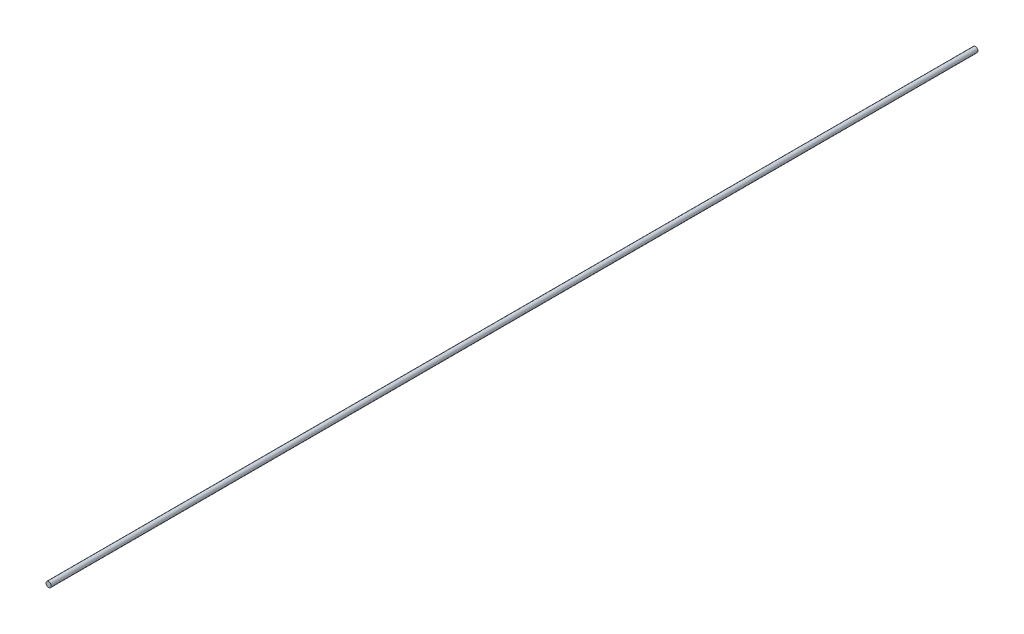
ISO-10303-21;
HEADER;
FILE_DESCRIPTION(('STEP AP214'),'2;1');
FILE_NAME('part.step','',(''),(''),'','','');
FILE_SCHEMA(('AUTOMOTIVE_DESIGN { 1 0 10303 214 1 1 1 1 }'));
ENDSEC;
DATA;
#1=APPLICATION_CONTEXT('core data for automotive mechanical design processes');
#2=APPLICATION_PROTOCOL_DEFINITION('international standard','automotive_design',2000,#1);
#3=PRODUCT_CONTEXT('',#1,'mechanical');
#4=PRODUCT('Part','Part','',(#3));
#5=PRODUCT_RELATED_PRODUCT_CATEGORY('part','',(#4));
#6=PRODUCT_DEFINITION_FORMATION('','',#4);
#7=PRODUCT_DEFINITION_CONTEXT('part definition',#1,'design');
#8=PRODUCT_DEFINITION('design','',#6,#7);
#9=PRODUCT_DEFINITION_SHAPE('','',#8);
#10=(LENGTH_UNIT() NAMED_UNIT(*) SI_UNIT(.MILLI.,.METRE.));
#11=(NAMED_UNIT(*) PLANE_ANGLE_UNIT() SI_UNIT($,.RADIAN.));
#12=(NAMED_UNIT(*) SI_UNIT($,.STERADIAN.) SOLID_ANGLE_UNIT());
#13=UNCERTAINTY_MEASURE_WITH_UNIT(LENGTH_MEASURE(1.E-05),#10,'distance_accuracy_value','');
#14=(GEOMETRIC_REPRESENTATION_CONTEXT(3) GLOBAL_UNCERTAINTY_ASSIGNED_CONTEXT((#13)) GLOBAL_UNIT_ASSIGNED_CONTEXT((#10,
#11,#12)) REPRESENTATION_CONTEXT('',''));
#15=CARTESIAN_POINT('',(0.,0.,0.));
#16=DIRECTION('',(0.,0.,1.));
#17=DIRECTION('',(1.,0.,0.));
#18=AXIS2_PLACEMENT_3D('',#15,#16,#17);
#19=CARTESIAN_POINT('',(0.,0.,4488.55050381641));
#20=DIRECTION('',(0.,0.,-1.));
#21=DIRECTION('',(-1.,0.,0.));
#22=AXIS2_PLACEMENT_3D('',#19,#20,#21);
#23=CYLINDRICAL_SURFACE('',#22,12.7);
#24=CARTESIAN_POINT('',(0.,0.,4488.55050381641));
#25=DIRECTION('',(0.,0.,1.));
#26=DIRECTION('',(1.,0.,0.));
#27=AXIS2_PLACEMENT_3D('',#24,#25,#26);
#28=CIRCLE('',#27,12.7);
#29=CARTESIAN_POINT('',(12.7,0.,4488.55050381641));
#30=VERTEX_POINT('',#29);
#31=EDGE_CURVE('E11',#30,#30,#28,.T.);
#32=ORIENTED_EDGE('',*,*,#31,.F.);
#33=EDGE_LOOP('',(#32));
#34=FACE_BOUND('',#33,.T.);
#35=CARTESIAN_POINT('',(0.,0.,0.));
#36=DIRECTION('',(0.,0.,1.));
#37=DIRECTION('',(1.,0.,0.));
#38=AXIS2_PLACEMENT_3D('',#35,#36,#37);
#39=CIRCLE('',#38,12.7);
#40=CARTESIAN_POINT('',(12.7,0.,0.));
#41=VERTEX_POINT('',#40);
#42=EDGE_CURVE('E49',#41,#41,#39,.T.);
#43=ORIENTED_EDGE('',*,*,#42,.T.);
#44=EDGE_LOOP('',(#43));
#45=FACE_BOUND('',#44,.T.);
#46=ADVANCED_FACE('F50',(#34,#45),#23,.T.);
#47=CARTESIAN_POINT('',(0.,0.,4488.55050381641));
#48=DIRECTION('',(0.,0.,1.));
#49=DIRECTION('',(1.,0.,0.));
#50=AXIS2_PLACEMENT_3D('',#47,#48,#49);
#51=PLANE('',#50);
#52=ORIENTED_EDGE('',*,*,#31,.T.);
#53=EDGE_LOOP('',(#52));
#54=FACE_BOUND('',#53,.T.);
#55=ADVANCED_FACE('F62',(#54),#51,.T.);
#56=CARTESIAN_POINT('',(0.,0.,0.));
#57=DIRECTION('',(0.,0.,1.));
#58=DIRECTION('',(1.,0.,0.));
#59=AXIS2_PLACEMENT_3D('',#56,#57,#58);
#60=PLANE('',#59);
#61=ORIENTED_EDGE('',*,*,#42,.F.);
#62=EDGE_LOOP('',(#61));
#63=FACE_BOUND('',#62,.T.);
#64=ADVANCED_FACE('F65',(#63),#60,.F.);
#65=CLOSED_SHELL('',(#46,#55,#64));
#66=MANIFOLD_SOLID_BREP('B2',#65);
#67=ADVANCED_BREP_SHAPE_REPRESENTATION('',(#18,#66),#14);
#68=SHAPE_DEFINITION_REPRESENTATION(#9,#67);
ENDSEC;
END-ISO-10303-21;
